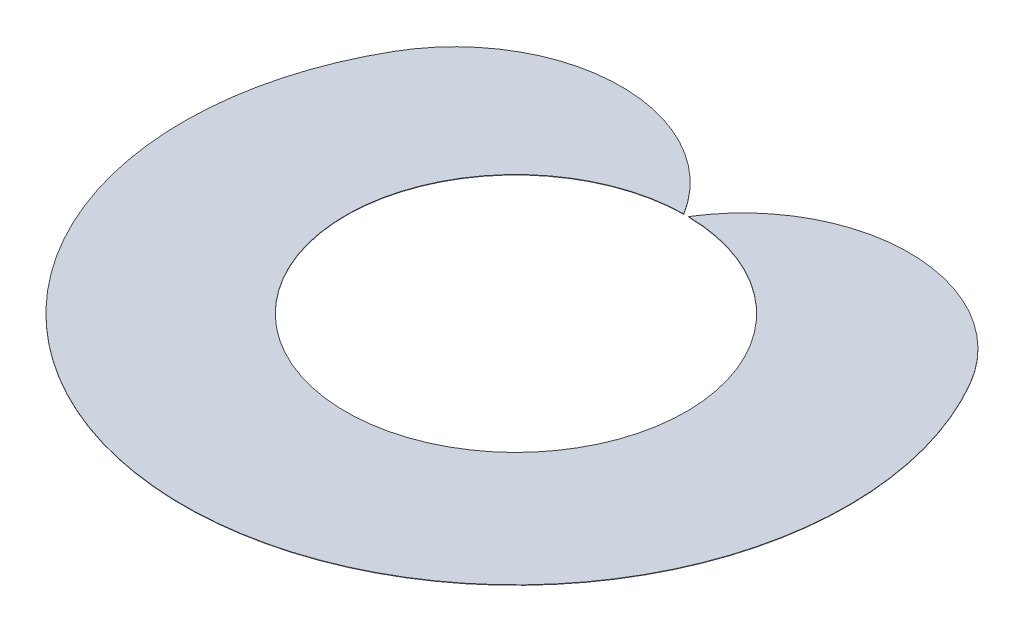
ISO-10303-21;
HEADER;
FILE_DESCRIPTION(('STEP AP214'),'2;1');
FILE_NAME('part.step','',(''),(''),'','','');
FILE_SCHEMA(('AUTOMOTIVE_DESIGN { 1 0 10303 214 1 1 1 1 }'));
ENDSEC;
DATA;
#1=APPLICATION_CONTEXT('core data for automotive mechanical design processes');
#2=APPLICATION_PROTOCOL_DEFINITION('international standard','automotive_design',2000,#1);
#3=PRODUCT_CONTEXT('',#1,'mechanical');
#4=PRODUCT('Part','Part','',(#3));
#5=PRODUCT_RELATED_PRODUCT_CATEGORY('part','',(#4));
#6=PRODUCT_DEFINITION_FORMATION('','',#4);
#7=PRODUCT_DEFINITION_CONTEXT('part definition',#1,'design');
#8=PRODUCT_DEFINITION('design','',#6,#7);
#9=PRODUCT_DEFINITION_SHAPE('','',#8);
#10=(LENGTH_UNIT() NAMED_UNIT(*) SI_UNIT(.MILLI.,.METRE.));
#11=(NAMED_UNIT(*) PLANE_ANGLE_UNIT() SI_UNIT($,.RADIAN.));
#12=(NAMED_UNIT(*) SI_UNIT($,.STERADIAN.) SOLID_ANGLE_UNIT());
#13=UNCERTAINTY_MEASURE_WITH_UNIT(LENGTH_MEASURE(1.E-05),#10,'distance_accuracy_value','');
#14=(GEOMETRIC_REPRESENTATION_CONTEXT(3) GLOBAL_UNCERTAINTY_ASSIGNED_CONTEXT((#13)) GLOBAL_UNIT_ASSIGNED_CONTEXT((#10,
#11,#12)) REPRESENTATION_CONTEXT('',''));
#15=CARTESIAN_POINT('',(0.,0.,0.));
#16=DIRECTION('',(0.,0.,1.));
#17=DIRECTION('',(1.,0.,0.));
#18=AXIS2_PLACEMENT_3D('',#15,#16,#17);
#19=CARTESIAN_POINT('',(-4.44089209850063E-13,101.,360.));
#20=DIRECTION('',(0.,-1.,0.));
#21=DIRECTION('',(0.,0.,-1.));
#22=AXIS2_PLACEMENT_3D('',#19,#20,#21);
#23=CYLINDRICAL_SURFACE('',#22,820.);
#24=CARTESIAN_POINT('',(-4.44089209850063E-13,100.,360.));
#25=DIRECTION('',(0.,-1.,0.));
#26=DIRECTION('',(1.,0.,0.));
#27=AXIS2_PLACEMENT_3D('',#24,#25,#26);
#28=CIRCLE('',#27,820.);
#29=CARTESIAN_POINT('',(710.14083110324,100.,-50.0000000000006));
#30=VERTEX_POINT('',#29);
#31=CARTESIAN_POINT('',(-710.140831103239,100.,-50.0000000000007));
#32=VERTEX_POINT('',#31);
#33=EDGE_CURVE('E71',#30,#32,#28,.T.);
#34=ORIENTED_EDGE('',*,*,#33,.F.);
#35=DIRECTION('',(0.,-1.,0.));
#36=VECTOR('',#35,1.);
#37=CARTESIAN_POINT('',(710.14083110324,101.,-50.0000000000006));
#38=LINE('',#37,#36);
#39=CARTESIAN_POINT('',(710.14083110324,101.,-50.0000000000006));
#40=VERTEX_POINT('',#39);
#41=EDGE_CURVE('E121',#40,#30,#38,.T.);
#42=ORIENTED_EDGE('',*,*,#41,.F.);
#43=CARTESIAN_POINT('',(-4.44089209850063E-13,101.,360.));
#44=DIRECTION('',(0.,-1.,0.));
#45=DIRECTION('',(1.,0.,0.));
#46=AXIS2_PLACEMENT_3D('',#43,#44,#45);
#47=CIRCLE('',#46,820.);
#48=CARTESIAN_POINT('',(-710.140831103239,101.,-50.0000000000007));
#49=VERTEX_POINT('',#48);
#50=EDGE_CURVE('E11',#40,#49,#47,.T.);
#51=ORIENTED_EDGE('',*,*,#50,.T.);
#52=DIRECTION('',(0.,-1.,0.));
#53=VECTOR('',#52,1.);
#54=CARTESIAN_POINT('',(-710.140831103239,101.,-50.0000000000007));
#55=LINE('',#54,#53);
#56=EDGE_CURVE('E59',#49,#32,#55,.T.);
#57=ORIENTED_EDGE('',*,*,#56,.T.);
#58=EDGE_LOOP('',(#34,#42,#51,#57));
#59=FACE_BOUND('',#58,.T.);
#60=ADVANCED_FACE('F49',(#59),#23,.T.);
#61=CARTESIAN_POINT('',(355.070415551619,101.,155.));
#62=DIRECTION('',(0.,-1.,0.));
#63=DIRECTION('',(0.,0.,-1.));
#64=AXIS2_PLACEMENT_3D('',#61,#62,#63);
#65=CYLINDRICAL_SURFACE('',#64,410.);
#66=DIRECTION('',(0.,-1.,0.));
#67=VECTOR('',#66,1.);
#68=CARTESIAN_POINT('',(5.87753316284345,75.,-59.858862719271));
#69=LINE('',#68,#67);
#70=CARTESIAN_POINT('',(5.8775331628434,101.,-59.858862719271));
#71=VERTEX_POINT('',#70);
#72=CARTESIAN_POINT('',(5.87753316284345,100.,-59.8588627192711));
#73=VERTEX_POINT('',#72);
#74=EDGE_CURVE('E87',#71,#73,#69,.T.);
#75=ORIENTED_EDGE('',*,*,#74,.F.);
#76=CARTESIAN_POINT('',(355.070415551619,101.,155.));
#77=DIRECTION('',(0.,-1.,0.));
#78=DIRECTION('',(1.,0.,0.));
#79=AXIS2_PLACEMENT_3D('',#76,#77,#78);
#80=CIRCLE('',#79,410.);
#81=EDGE_CURVE('E134',#71,#40,#80,.T.);
#82=ORIENTED_EDGE('',*,*,#81,.T.);
#83=ORIENTED_EDGE('',*,*,#41,.T.);
#84=CARTESIAN_POINT('',(355.070415551619,100.,155.));
#85=DIRECTION('',(0.,-1.,0.));
#86=DIRECTION('',(1.,0.,0.));
#87=AXIS2_PLACEMENT_3D('',#84,#85,#86);
#88=CIRCLE('',#87,410.);
#89=EDGE_CURVE('E124',#73,#30,#88,.T.);
#90=ORIENTED_EDGE('',*,*,#89,.F.);
#91=EDGE_LOOP('',(#75,#82,#83,#90));
#92=FACE_BOUND('',#91,.T.);
#93=ADVANCED_FACE('F171',(#92),#65,.T.);
#94=CARTESIAN_POINT('',(-355.07041555162,101.,155.));
#95=DIRECTION('',(0.,-1.,0.));
#96=DIRECTION('',(0.,0.,-1.));
#97=AXIS2_PLACEMENT_3D('',#94,#95,#96);
#98=CYLINDRICAL_SURFACE('',#97,410.);
#99=CARTESIAN_POINT('',(-355.07041555162,101.,155.));
#100=DIRECTION('',(0.,1.,0.));
#101=DIRECTION('',(-1.,0.,0.));
#102=AXIS2_PLACEMENT_3D('',#99,#100,#101);
#103=CIRCLE('',#102,410.);
#104=CARTESIAN_POINT('',(-5.87753316284434,101.,-59.8588627192711));
#105=VERTEX_POINT('',#104);
#106=EDGE_CURVE('E114',#105,#49,#103,.T.);
#107=ORIENTED_EDGE('',*,*,#106,.F.);
#108=DIRECTION('',(0.,-1.,0.));
#109=VECTOR('',#108,1.);
#110=CARTESIAN_POINT('',(-5.87753316284434,75.,-59.8588627192712));
#111=LINE('',#110,#109);
#112=CARTESIAN_POINT('',(-5.87753316284434,100.,-59.858862719271));
#113=VERTEX_POINT('',#112);
#114=EDGE_CURVE('E52',#105,#113,#111,.T.);
#115=ORIENTED_EDGE('',*,*,#114,.T.);
#116=CARTESIAN_POINT('',(-355.07041555162,100.,155.));
#117=DIRECTION('',(0.,1.,0.));
#118=DIRECTION('',(-1.,0.,0.));
#119=AXIS2_PLACEMENT_3D('',#116,#117,#118);
#120=CIRCLE('',#119,410.);
#121=EDGE_CURVE('E106',#113,#32,#120,.T.);
#122=ORIENTED_EDGE('',*,*,#121,.T.);
#123=ORIENTED_EDGE('',*,*,#56,.F.);
#124=EDGE_LOOP('',(#107,#115,#122,#123));
#125=FACE_BOUND('',#124,.T.);
#126=ADVANCED_FACE('F117',(#125),#98,.T.);
#127=CARTESIAN_POINT('',(177.535207775809,101.,257.5));
#128=DIRECTION('',(0.,1.,0.));
#129=DIRECTION('',(1.,0.,0.));
#130=AXIS2_PLACEMENT_3D('',#127,#128,#129);
#131=PLANE('',#130);
#132=CARTESIAN_POINT('',(0.,101.,360.));
#133=DIRECTION('',(0.,1.,0.));
#134=DIRECTION('',(0.,0.,1.));
#135=AXIS2_PLACEMENT_3D('',#132,#133,#134);
#136=CIRCLE('',#135,419.9);
#137=EDGE_CURVE('E145',#105,#71,#136,.T.);
#138=ORIENTED_EDGE('',*,*,#137,.F.);
#139=ORIENTED_EDGE('',*,*,#106,.T.);
#140=ORIENTED_EDGE('',*,*,#50,.F.);
#141=ORIENTED_EDGE('',*,*,#81,.F.);
#142=EDGE_LOOP('',(#138,#139,#140,#141));
#143=FACE_BOUND('',#142,.T.);
#144=ADVANCED_FACE('F185',(#143),#131,.T.);
#145=CARTESIAN_POINT('',(177.535207775809,100.,257.5));
#146=DIRECTION('',(0.,1.,0.));
#147=DIRECTION('',(1.,0.,0.));
#148=AXIS2_PLACEMENT_3D('',#145,#146,#147);
#149=PLANE('',#148);
#150=ORIENTED_EDGE('',*,*,#121,.F.);
#151=CARTESIAN_POINT('',(0.,100.,360.));
#152=DIRECTION('',(0.,1.,0.));
#153=DIRECTION('',(0.,0.,1.));
#154=AXIS2_PLACEMENT_3D('',#151,#152,#153);
#155=CIRCLE('',#154,419.9);
#156=EDGE_CURVE('E110',#113,#73,#155,.T.);
#157=ORIENTED_EDGE('',*,*,#156,.T.);
#158=ORIENTED_EDGE('',*,*,#89,.T.);
#159=ORIENTED_EDGE('',*,*,#33,.T.);
#160=EDGE_LOOP('',(#150,#157,#158,#159));
#161=FACE_BOUND('',#160,.T.);
#162=ADVANCED_FACE('F108',(#161),#149,.F.);
#163=CARTESIAN_POINT('',(0.,150.,360.));
#164=DIRECTION('',(0.,-1.,0.));
#165=DIRECTION('',(0.,0.,-1.));
#166=AXIS2_PLACEMENT_3D('',#163,#164,#165);
#167=CYLINDRICAL_SURFACE('',#166,419.9);
#168=ORIENTED_EDGE('',*,*,#137,.T.);
#169=ORIENTED_EDGE('',*,*,#74,.T.);
#170=ORIENTED_EDGE('',*,*,#156,.F.);
#171=ORIENTED_EDGE('',*,*,#114,.F.);
#172=EDGE_LOOP('',(#168,#169,#170,#171));
#173=FACE_BOUND('',#172,.T.);
#174=ADVANCED_FACE('F122',(#173),#167,.F.);
#175=CLOSED_SHELL('',(#60,#93,#126,#144,#162,#174));
#176=MANIFOLD_SOLID_BREP('B2',#175);
#177=ADVANCED_BREP_SHAPE_REPRESENTATION('',(#18,#176),#14);
#178=SHAPE_DEFINITION_REPRESENTATION(#9,#177);
ENDSEC;
END-ISO-10303-21;
